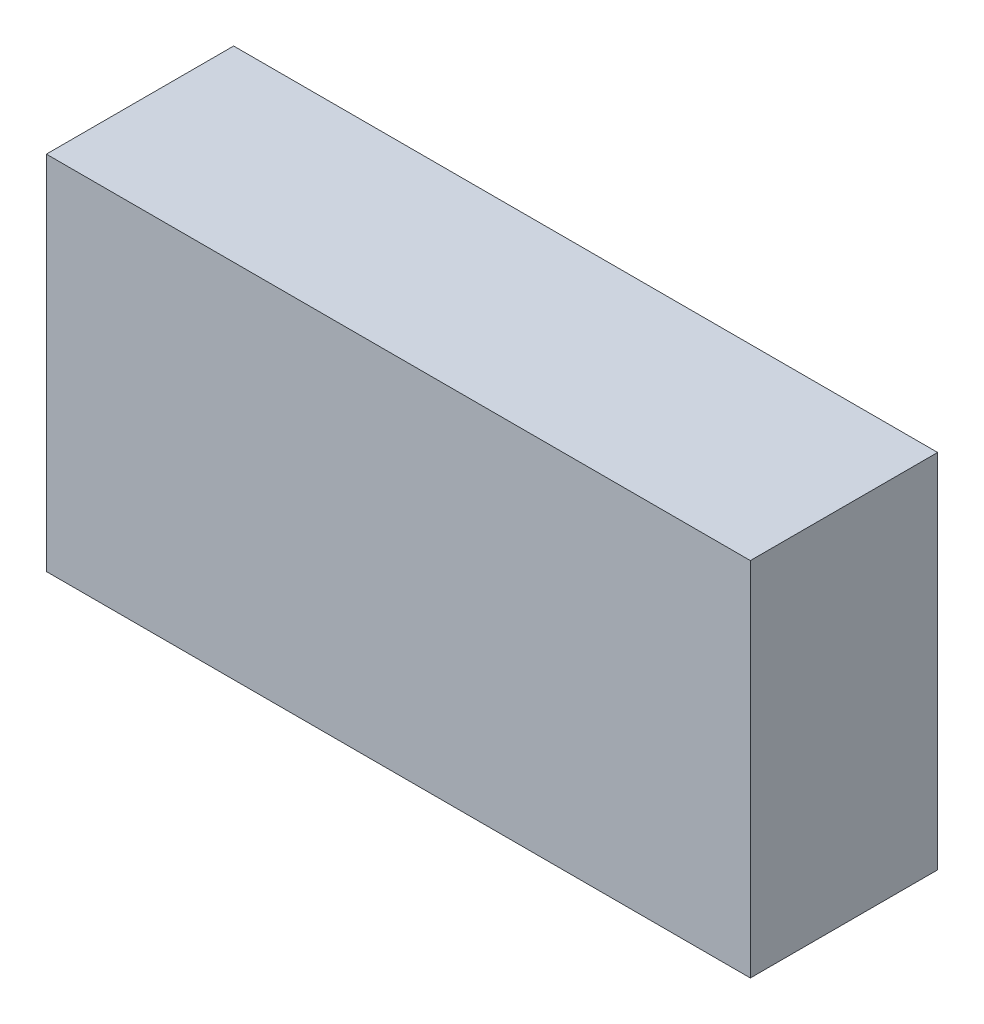
ISO-10303-21;
HEADER;
FILE_DESCRIPTION(('STEP AP214'),'2;1');
FILE_NAME('part.step','',(''),(''),'','','');
FILE_SCHEMA(('AUTOMOTIVE_DESIGN { 1 0 10303 214 1 1 1 1 }'));
ENDSEC;
DATA;
#1=APPLICATION_CONTEXT('core data for automotive mechanical design processes');
#2=APPLICATION_PROTOCOL_DEFINITION('international standard','automotive_design',2000,#1);
#3=PRODUCT_CONTEXT('',#1,'mechanical');
#4=PRODUCT('Part','Part','',(#3));
#5=PRODUCT_RELATED_PRODUCT_CATEGORY('part','',(#4));
#6=PRODUCT_DEFINITION_FORMATION('','',#4);
#7=PRODUCT_DEFINITION_CONTEXT('part definition',#1,'design');
#8=PRODUCT_DEFINITION('design','',#6,#7);
#9=PRODUCT_DEFINITION_SHAPE('','',#8);
#10=(LENGTH_UNIT() NAMED_UNIT(*) SI_UNIT(.MILLI.,.METRE.));
#11=(NAMED_UNIT(*) PLANE_ANGLE_UNIT() SI_UNIT($,.RADIAN.));
#12=(NAMED_UNIT(*) SI_UNIT($,.STERADIAN.) SOLID_ANGLE_UNIT());
#13=UNCERTAINTY_MEASURE_WITH_UNIT(LENGTH_MEASURE(1.E-05),#10,'distance_accuracy_value','');
#14=(GEOMETRIC_REPRESENTATION_CONTEXT(3) GLOBAL_UNCERTAINTY_ASSIGNED_CONTEXT((#13)) GLOBAL_UNIT_ASSIGNED_CONTEXT((#10,
#11,#12)) REPRESENTATION_CONTEXT('',''));
#15=CARTESIAN_POINT('',(0.,0.,0.));
#16=DIRECTION('',(0.,0.,1.));
#17=DIRECTION('',(1.,0.,0.));
#18=AXIS2_PLACEMENT_3D('',#15,#16,#17);
#19=CARTESIAN_POINT('',(-2.2352,-0.9652,1.));
#20=DIRECTION('',(1.,0.,0.));
#21=DIRECTION('',(0.,0.,-1.));
#22=AXIS2_PLACEMENT_3D('',#19,#20,#21);
#23=PLANE('',#22);
#24=DIRECTION('',(0.,-1.,0.));
#25=VECTOR('',#24,1.);
#26=CARTESIAN_POINT('',(-2.2352,-0.9652,0.));
#27=LINE('',#26,#25);
#28=CARTESIAN_POINT('',(-2.2352,0.9652,0.));
#29=VERTEX_POINT('',#28);
#30=CARTESIAN_POINT('',(-2.2352,-0.9652,0.));
#31=VERTEX_POINT('',#30);
#32=EDGE_CURVE('E95',#29,#31,#27,.T.);
#33=ORIENTED_EDGE('',*,*,#32,.T.);
#34=DIRECTION('',(0.,0.,-1.));
#35=VECTOR('',#34,1.);
#36=CARTESIAN_POINT('',(-2.2352,-0.9652,1.));
#37=LINE('',#36,#35);
#38=CARTESIAN_POINT('',(-2.2352,-0.9652,1.));
#39=VERTEX_POINT('',#38);
#40=EDGE_CURVE('E11',#39,#31,#37,.T.);
#41=ORIENTED_EDGE('',*,*,#40,.F.);
#42=DIRECTION('',(0.,-1.,0.));
#43=VECTOR('',#42,1.);
#44=CARTESIAN_POINT('',(-2.2352,-0.9652,1.));
#45=LINE('',#44,#43);
#46=CARTESIAN_POINT('',(-2.2352,0.9652,1.));
#47=VERTEX_POINT('',#46);
#48=EDGE_CURVE('E83',#47,#39,#45,.T.);
#49=ORIENTED_EDGE('',*,*,#48,.F.);
#50=DIRECTION('',(0.,0.,-1.));
#51=VECTOR('',#50,1.);
#52=CARTESIAN_POINT('',(-2.2352,0.9652,1.));
#53=LINE('',#52,#51);
#54=EDGE_CURVE('E91',#47,#29,#53,.T.);
#55=ORIENTED_EDGE('',*,*,#54,.T.);
#56=EDGE_LOOP('',(#33,#41,#49,#55));
#57=FACE_BOUND('',#56,.T.);
#58=ADVANCED_FACE('F32',(#57),#23,.F.);
#59=CARTESIAN_POINT('',(1.524,-0.9652,1.));
#60=DIRECTION('',(0.,1.,0.));
#61=DIRECTION('',(0.,0.,1.));
#62=AXIS2_PLACEMENT_3D('',#59,#60,#61);
#63=PLANE('',#62);
#64=DIRECTION('',(1.,0.,0.));
#65=VECTOR('',#64,1.);
#66=CARTESIAN_POINT('',(1.524,-0.9652,0.));
#67=LINE('',#66,#65);
#68=CARTESIAN_POINT('',(1.524,-0.9652,0.));
#69=VERTEX_POINT('',#68);
#70=EDGE_CURVE('E87',#31,#69,#67,.T.);
#71=ORIENTED_EDGE('',*,*,#70,.T.);
#72=DIRECTION('',(0.,0.,-1.));
#73=VECTOR('',#72,1.);
#74=CARTESIAN_POINT('',(1.524,-0.9652,1.));
#75=LINE('',#74,#73);
#76=CARTESIAN_POINT('',(1.524,-0.9652,1.));
#77=VERTEX_POINT('',#76);
#78=EDGE_CURVE('E40',#77,#69,#75,.T.);
#79=ORIENTED_EDGE('',*,*,#78,.F.);
#80=DIRECTION('',(1.,0.,0.));
#81=VECTOR('',#80,1.);
#82=CARTESIAN_POINT('',(1.524,-0.9652,1.));
#83=LINE('',#82,#81);
#84=EDGE_CURVE('E78',#39,#77,#83,.T.);
#85=ORIENTED_EDGE('',*,*,#84,.F.);
#86=ORIENTED_EDGE('',*,*,#40,.T.);
#87=EDGE_LOOP('',(#71,#79,#85,#86));
#88=FACE_BOUND('',#87,.T.);
#89=ADVANCED_FACE('F86',(#88),#63,.F.);
#90=CARTESIAN_POINT('',(1.524,0.9652,1.));
#91=DIRECTION('',(-1.,0.,0.));
#92=DIRECTION('',(0.,0.,1.));
#93=AXIS2_PLACEMENT_3D('',#90,#91,#92);
#94=PLANE('',#93);
#95=DIRECTION('',(0.,1.,0.));
#96=VECTOR('',#95,1.);
#97=CARTESIAN_POINT('',(1.524,0.9652,0.));
#98=LINE('',#97,#96);
#99=CARTESIAN_POINT('',(1.524,0.9652,0.));
#100=VERTEX_POINT('',#99);
#101=EDGE_CURVE('E65',#69,#100,#98,.T.);
#102=ORIENTED_EDGE('',*,*,#101,.T.);
#103=DIRECTION('',(0.,0.,-1.));
#104=VECTOR('',#103,1.);
#105=CARTESIAN_POINT('',(1.524,0.9652,1.));
#106=LINE('',#105,#104);
#107=CARTESIAN_POINT('',(1.524,0.9652,1.));
#108=VERTEX_POINT('',#107);
#109=EDGE_CURVE('E88',#108,#100,#106,.T.);
#110=ORIENTED_EDGE('',*,*,#109,.F.);
#111=DIRECTION('',(0.,1.,0.));
#112=VECTOR('',#111,1.);
#113=CARTESIAN_POINT('',(1.524,0.9652,1.));
#114=LINE('',#113,#112);
#115=EDGE_CURVE('E81',#77,#108,#114,.T.);
#116=ORIENTED_EDGE('',*,*,#115,.F.);
#117=ORIENTED_EDGE('',*,*,#78,.T.);
#118=EDGE_LOOP('',(#102,#110,#116,#117));
#119=FACE_BOUND('',#118,.T.);
#120=ADVANCED_FACE('F89',(#119),#94,.F.);
#121=CARTESIAN_POINT('',(-2.2352,0.9652,1.));
#122=DIRECTION('',(0.,-1.,0.));
#123=DIRECTION('',(0.,0.,-1.));
#124=AXIS2_PLACEMENT_3D('',#121,#122,#123);
#125=PLANE('',#124);
#126=DIRECTION('',(-1.,0.,0.));
#127=VECTOR('',#126,1.);
#128=CARTESIAN_POINT('',(-2.2352,0.9652,0.));
#129=LINE('',#128,#127);
#130=EDGE_CURVE('E71',#100,#29,#129,.T.);
#131=ORIENTED_EDGE('',*,*,#130,.T.);
#132=ORIENTED_EDGE('',*,*,#54,.F.);
#133=DIRECTION('',(-1.,0.,0.));
#134=VECTOR('',#133,1.);
#135=CARTESIAN_POINT('',(-2.2352,0.9652,1.));
#136=LINE('',#135,#134);
#137=EDGE_CURVE('E48',#108,#47,#136,.T.);
#138=ORIENTED_EDGE('',*,*,#137,.F.);
#139=ORIENTED_EDGE('',*,*,#109,.T.);
#140=EDGE_LOOP('',(#131,#132,#138,#139));
#141=FACE_BOUND('',#140,.T.);
#142=ADVANCED_FACE('F102',(#141),#125,.F.);
#143=CARTESIAN_POINT('',(0.,0.,1.));
#144=DIRECTION('',(0.,0.,-1.));
#145=DIRECTION('',(-1.,0.,0.));
#146=AXIS2_PLACEMENT_3D('',#143,#144,#145);
#147=PLANE('',#146);
#148=ORIENTED_EDGE('',*,*,#48,.T.);
#149=ORIENTED_EDGE('',*,*,#84,.T.);
#150=ORIENTED_EDGE('',*,*,#115,.T.);
#151=ORIENTED_EDGE('',*,*,#137,.T.);
#152=EDGE_LOOP('',(#148,#149,#150,#151));
#153=FACE_BOUND('',#152,.T.);
#154=ADVANCED_FACE('F79',(#153),#147,.F.);
#155=CARTESIAN_POINT('',(0.,0.,0.));
#156=DIRECTION('',(0.,0.,-1.));
#157=DIRECTION('',(-1.,0.,0.));
#158=AXIS2_PLACEMENT_3D('',#155,#156,#157);
#159=PLANE('',#158);
#160=ORIENTED_EDGE('',*,*,#32,.F.);
#161=ORIENTED_EDGE('',*,*,#130,.F.);
#162=ORIENTED_EDGE('',*,*,#101,.F.);
#163=ORIENTED_EDGE('',*,*,#70,.F.);
#164=EDGE_LOOP('',(#160,#161,#162,#163));
#165=FACE_BOUND('',#164,.T.);
#166=ADVANCED_FACE('F105',(#165),#159,.T.);
#167=CLOSED_SHELL('',(#58,#89,#120,#142,#154,#166));
#168=MANIFOLD_SOLID_BREP('B2',#167);
#169=ADVANCED_BREP_SHAPE_REPRESENTATION('',(#18,#168),#14);
#170=SHAPE_DEFINITION_REPRESENTATION(#9,#169);
ENDSEC;
END-ISO-10303-21;
